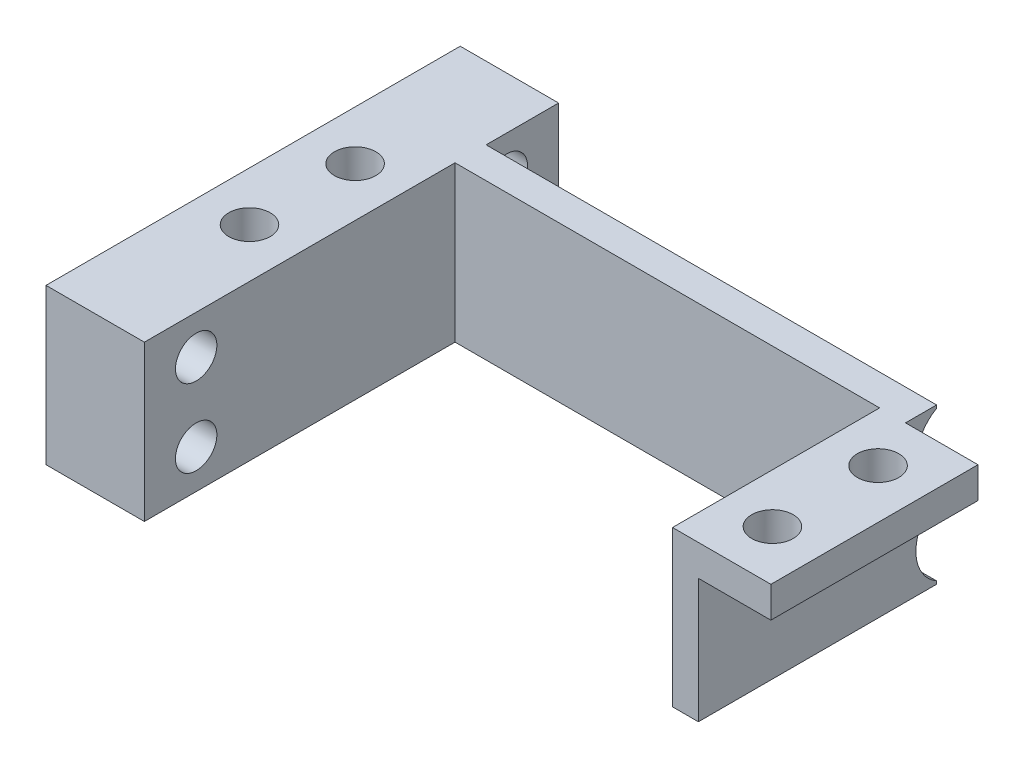
ISO-10303-21;
HEADER;
FILE_DESCRIPTION(('STEP AP214'),'2;1');
FILE_NAME('part.step','',(''),(''),'','','');
FILE_SCHEMA(('AUTOMOTIVE_DESIGN { 1 0 10303 214 1 1 1 1 }'));
ENDSEC;
DATA;
#1=APPLICATION_CONTEXT('core data for automotive mechanical design processes');
#2=APPLICATION_PROTOCOL_DEFINITION('international standard','automotive_design',2000,#1);
#3=PRODUCT_CONTEXT('',#1,'mechanical');
#4=PRODUCT('Part','Part','',(#3));
#5=PRODUCT_RELATED_PRODUCT_CATEGORY('part','',(#4));
#6=PRODUCT_DEFINITION_FORMATION('','',#4);
#7=PRODUCT_DEFINITION_CONTEXT('part definition',#1,'design');
#8=PRODUCT_DEFINITION('design','',#6,#7);
#9=PRODUCT_DEFINITION_SHAPE('','',#8);
#10=(LENGTH_UNIT() NAMED_UNIT(*) SI_UNIT(.MILLI.,.METRE.));
#11=(NAMED_UNIT(*) PLANE_ANGLE_UNIT() SI_UNIT($,.RADIAN.));
#12=(NAMED_UNIT(*) SI_UNIT($,.STERADIAN.) SOLID_ANGLE_UNIT());
#13=UNCERTAINTY_MEASURE_WITH_UNIT(LENGTH_MEASURE(1.E-05),#10,'distance_accuracy_value','');
#14=(GEOMETRIC_REPRESENTATION_CONTEXT(3) GLOBAL_UNCERTAINTY_ASSIGNED_CONTEXT((#13)) GLOBAL_UNIT_ASSIGNED_CONTEXT((#10,
#11,#12)) REPRESENTATION_CONTEXT('',''));
#15=CARTESIAN_POINT('',(0.,0.,0.));
#16=DIRECTION('',(0.,0.,1.));
#17=DIRECTION('',(1.,0.,0.));
#18=AXIS2_PLACEMENT_3D('',#15,#16,#17);
#19=CARTESIAN_POINT('',(0.,0.,0.));
#20=DIRECTION('',(0.,0.,-1.));
#21=DIRECTION('',(-1.,0.,0.));
#22=AXIS2_PLACEMENT_3D('',#19,#20,#21);
#23=PLANE('',#22);
#24=DIRECTION('',(0.,-1.,0.));
#25=VECTOR('',#24,1.);
#26=CARTESIAN_POINT('',(2.5,0.,0.));
#27=LINE('',#26,#25);
#28=CARTESIAN_POINT('',(2.5,7.78589838486224,0.));
#29=VERTEX_POINT('',#28);
#30=CARTESIAN_POINT('',(2.5,7.21410161513775,0.));
#31=VERTEX_POINT('',#30);
#32=EDGE_CURVE('E47',#29,#31,#27,.T.);
#33=ORIENTED_EDGE('',*,*,#32,.F.);
#34=DIRECTION('',(-1.,0.,0.));
#35=VECTOR('',#34,1.);
#36=CARTESIAN_POINT('',(53.001,7.78589838486224,0.));
#37=LINE('',#36,#35);
#38=CARTESIAN_POINT('',(46.,7.78589838486224,0.));
#39=VERTEX_POINT('',#38);
#40=EDGE_CURVE('E191',#39,#29,#37,.T.);
#41=ORIENTED_EDGE('',*,*,#40,.F.);
#42=DIRECTION('',(0.,1.,0.));
#43=VECTOR('',#42,1.);
#44=CARTESIAN_POINT('',(46.,0.,0.));
#45=LINE('',#44,#43);
#46=CARTESIAN_POINT('',(46.,7.21410161513775,0.));
#47=VERTEX_POINT('',#46);
#48=EDGE_CURVE('E352',#47,#39,#45,.T.);
#49=ORIENTED_EDGE('',*,*,#48,.F.);
#50=DIRECTION('',(-1.,0.,0.));
#51=VECTOR('',#50,1.);
#52=CARTESIAN_POINT('',(53.001,7.21410161513775,0.));
#53=LINE('',#52,#51);
#54=EDGE_CURVE('E455',#31,#47,#53,.F.);
#55=ORIENTED_EDGE('',*,*,#54,.F.);
#56=EDGE_LOOP('',(#33,#41,#49,#55));
#57=FACE_BOUND('',#56,.T.);
#58=ADVANCED_FACE('F38',(#57),#23,.T.);
#59=CARTESIAN_POINT('',(46.,14.7141016151377,0.));
#60=VERTEX_POINT('',#59);
#61=CARTESIAN_POINT('',(46.,15.,0.));
#62=VERTEX_POINT('',#61);
#63=EDGE_CURVE('E204',#60,#62,#45,.T.);
#64=ORIENTED_EDGE('',*,*,#63,.F.);
#65=DIRECTION('',(-1.,0.,0.));
#66=VECTOR('',#65,1.);
#67=CARTESIAN_POINT('',(53.001,14.7141016151377,0.));
#68=LINE('',#67,#66);
#69=CARTESIAN_POINT('',(2.5,14.7141016151377,0.));
#70=VERTEX_POINT('',#69);
#71=EDGE_CURVE('E188',#70,#60,#68,.F.);
#72=ORIENTED_EDGE('',*,*,#71,.F.);
#73=CARTESIAN_POINT('',(2.5,15.,0.));
#74=VERTEX_POINT('',#73);
#75=EDGE_CURVE('E11',#74,#70,#27,.T.);
#76=ORIENTED_EDGE('',*,*,#75,.F.);
#77=DIRECTION('',(-1.,0.,0.));
#78=VECTOR('',#77,1.);
#79=CARTESIAN_POINT('',(0.,15.,0.));
#80=LINE('',#79,#78);
#81=EDGE_CURVE('E345',#62,#74,#80,.T.);
#82=ORIENTED_EDGE('',*,*,#81,.F.);
#83=EDGE_LOOP('',(#64,#72,#76,#82));
#84=FACE_BOUND('',#83,.T.);
#85=ADVANCED_FACE('F201',(#84),#23,.T.);
#86=CARTESIAN_POINT('',(2.5,0.285898384862242,0.));
#87=VERTEX_POINT('',#86);
#88=CARTESIAN_POINT('',(2.5,0.,0.));
#89=VERTEX_POINT('',#88);
#90=EDGE_CURVE('E49',#87,#89,#27,.T.);
#91=ORIENTED_EDGE('',*,*,#90,.F.);
#92=DIRECTION('',(-1.,0.,0.));
#93=VECTOR('',#92,1.);
#94=CARTESIAN_POINT('',(53.001,0.285898384862242,0.));
#95=LINE('',#94,#93);
#96=CARTESIAN_POINT('',(46.,0.285898384862242,0.));
#97=VERTEX_POINT('',#96);
#98=EDGE_CURVE('E205',#97,#87,#95,.T.);
#99=ORIENTED_EDGE('',*,*,#98,.F.);
#100=CARTESIAN_POINT('',(46.,0.,0.));
#101=VERTEX_POINT('',#100);
#102=EDGE_CURVE('E349',#101,#97,#45,.T.);
#103=ORIENTED_EDGE('',*,*,#102,.F.);
#104=DIRECTION('',(1.,0.,0.));
#105=VECTOR('',#104,1.);
#106=CARTESIAN_POINT('',(0.,0.,0.));
#107=LINE('',#106,#105);
#108=EDGE_CURVE('E342',#89,#101,#107,.T.);
#109=ORIENTED_EDGE('',*,*,#108,.F.);
#110=EDGE_LOOP('',(#91,#99,#103,#109));
#111=FACE_BOUND('',#110,.T.);
#112=ADVANCED_FACE('F432',(#111),#23,.T.);
#113=CARTESIAN_POINT('',(0.,0.,3.));
#114=DIRECTION('',(1.,0.,0.));
#115=DIRECTION('',(0.,0.,-1.));
#116=AXIS2_PLACEMENT_3D('',#113,#114,#115);
#117=PLANE('',#116);
#118=DIRECTION('',(0.,0.,1.));
#119=VECTOR('',#118,1.);
#120=CARTESIAN_POINT('',(0.,12.,23.));
#121=LINE('',#120,#119);
#122=CARTESIAN_POINT('',(0.,12.,3.));
#123=VERTEX_POINT('',#122);
#124=CARTESIAN_POINT('',(0.,12.,23.));
#125=VERTEX_POINT('',#124);
#126=EDGE_CURVE('E320',#123,#125,#121,.T.);
#127=ORIENTED_EDGE('',*,*,#126,.F.);
#128=DIRECTION('',(0.,-1.,0.));
#129=VECTOR('',#128,1.);
#130=CARTESIAN_POINT('',(0.,0.,3.));
#131=LINE('',#130,#129);
#132=CARTESIAN_POINT('',(0.,0.,3.));
#133=VERTEX_POINT('',#132);
#134=EDGE_CURVE('E230',#123,#133,#131,.T.);
#135=ORIENTED_EDGE('',*,*,#134,.T.);
#136=DIRECTION('',(0.,0.,-1.));
#137=VECTOR('',#136,1.);
#138=CARTESIAN_POINT('',(0.,0.,3.));
#139=LINE('',#138,#137);
#140=CARTESIAN_POINT('',(0.,0.,23.));
#141=VERTEX_POINT('',#140);
#142=EDGE_CURVE('E359',#141,#133,#139,.T.);
#143=ORIENTED_EDGE('',*,*,#142,.F.);
#144=DIRECTION('',(0.,-1.,0.));
#145=VECTOR('',#144,1.);
#146=CARTESIAN_POINT('',(0.,0.,23.));
#147=LINE('',#146,#145);
#148=EDGE_CURVE('E332',#125,#141,#147,.T.);
#149=ORIENTED_EDGE('',*,*,#148,.F.);
#150=EDGE_LOOP('',(#127,#135,#143,#149));
#151=FACE_BOUND('',#150,.T.);
#152=ADVANCED_FACE('F40',(#151),#117,.F.);
#153=CARTESIAN_POINT('',(0.,0.,3.));
#154=DIRECTION('',(0.,0.,-1.));
#155=DIRECTION('',(-1.,0.,0.));
#156=AXIS2_PLACEMENT_3D('',#153,#154,#155);
#157=PLANE('',#156);
#158=DIRECTION('',(1.,0.,0.));
#159=VECTOR('',#158,1.);
#160=CARTESIAN_POINT('',(0.,0.,3.));
#161=LINE('',#160,#159);
#162=CARTESIAN_POINT('',(2.5,0.,3.));
#163=VERTEX_POINT('',#162);
#164=CARTESIAN_POINT('',(43.5,0.,3.));
#165=VERTEX_POINT('',#164);
#166=EDGE_CURVE('E64',#163,#165,#161,.T.);
#167=ORIENTED_EDGE('',*,*,#166,.T.);
#168=DIRECTION('',(0.,1.,0.));
#169=VECTOR('',#168,1.);
#170=CARTESIAN_POINT('',(43.5,0.,3.));
#171=LINE('',#170,#169);
#172=CARTESIAN_POINT('',(43.5,15.,3.));
#173=VERTEX_POINT('',#172);
#174=EDGE_CURVE('E293',#165,#173,#171,.T.);
#175=ORIENTED_EDGE('',*,*,#174,.T.);
#176=DIRECTION('',(-1.,0.,0.));
#177=VECTOR('',#176,1.);
#178=CARTESIAN_POINT('',(0.,15.,3.));
#179=LINE('',#178,#177);
#180=CARTESIAN_POINT('',(2.5,15.,3.));
#181=VERTEX_POINT('',#180);
#182=EDGE_CURVE('E344',#173,#181,#179,.T.);
#183=ORIENTED_EDGE('',*,*,#182,.T.);
#184=DIRECTION('',(0.,1.,0.));
#185=VECTOR('',#184,1.);
#186=CARTESIAN_POINT('',(2.5,0.,3.));
#187=LINE('',#186,#185);
#188=EDGE_CURVE('E331',#163,#181,#187,.T.);
#189=ORIENTED_EDGE('',*,*,#188,.F.);
#190=EDGE_LOOP('',(#167,#175,#183,#189));
#191=FACE_BOUND('',#190,.T.);
#192=ADVANCED_FACE('F445',(#191),#157,.F.);
#193=CARTESIAN_POINT('',(0.,0.,3.));
#194=DIRECTION('',(0.,1.,0.));
#195=DIRECTION('',(0.,0.,1.));
#196=AXIS2_PLACEMENT_3D('',#193,#194,#195);
#197=PLANE('',#196);
#198=ORIENTED_EDGE('',*,*,#142,.T.);
#199=DIRECTION('',(1.,0.,0.));
#200=VECTOR('',#199,1.);
#201=CARTESIAN_POINT('',(2.5,0.,3.));
#202=LINE('',#201,#200);
#203=CARTESIAN_POINT('',(-7.00000000000001,0.,3.));
#204=VERTEX_POINT('',#203);
#205=EDGE_CURVE('E375',#204,#133,#202,.T.);
#206=ORIENTED_EDGE('',*,*,#205,.F.);
#207=DIRECTION('',(0.,0.,1.));
#208=VECTOR('',#207,1.);
#209=CARTESIAN_POINT('',(-7.00000000000001,0.,-7.));
#210=LINE('',#209,#208);
#211=CARTESIAN_POINT('',(-7.00000000000001,0.,-7.));
#212=VERTEX_POINT('',#211);
#213=EDGE_CURVE('E216',#212,#204,#210,.T.);
#214=ORIENTED_EDGE('',*,*,#213,.F.);
#215=DIRECTION('',(1.,0.,0.));
#216=VECTOR('',#215,1.);
#217=CARTESIAN_POINT('',(2.5,0.,-7.));
#218=LINE('',#217,#216);
#219=CARTESIAN_POINT('',(2.5,0.,-7.));
#220=VERTEX_POINT('',#219);
#221=EDGE_CURVE('E387',#212,#220,#218,.T.);
#222=ORIENTED_EDGE('',*,*,#221,.T.);
#223=DIRECTION('',(0.,0.,1.));
#224=VECTOR('',#223,1.);
#225=CARTESIAN_POINT('',(2.5,0.,-7.));
#226=LINE('',#225,#224);
#227=EDGE_CURVE('E220',#220,#89,#226,.T.);
#228=ORIENTED_EDGE('',*,*,#227,.T.);
#229=ORIENTED_EDGE('',*,*,#108,.T.);
#230=DIRECTION('',(0.,0.,-1.));
#231=VECTOR('',#230,1.);
#232=CARTESIAN_POINT('',(46.,0.,3.));
#233=LINE('',#232,#231);
#234=CARTESIAN_POINT('',(46.,0.,23.));
#235=VERTEX_POINT('',#234);
#236=EDGE_CURVE('E356',#235,#101,#233,.T.);
#237=ORIENTED_EDGE('',*,*,#236,.F.);
#238=DIRECTION('',(-1.,0.,0.));
#239=VECTOR('',#238,1.);
#240=CARTESIAN_POINT('',(46.,0.,23.));
#241=LINE('',#240,#239);
#242=CARTESIAN_POINT('',(43.5,0.,23.));
#243=VERTEX_POINT('',#242);
#244=EDGE_CURVE('E301',#235,#243,#241,.T.);
#245=ORIENTED_EDGE('',*,*,#244,.T.);
#246=DIRECTION('',(0.,0.,-1.));
#247=VECTOR('',#246,1.);
#248=CARTESIAN_POINT('',(43.5,0.,23.));
#249=LINE('',#248,#247);
#250=EDGE_CURVE('E304',#243,#165,#249,.T.);
#251=ORIENTED_EDGE('',*,*,#250,.T.);
#252=ORIENTED_EDGE('',*,*,#166,.F.);
#253=DIRECTION('',(0.,0.,-1.));
#254=VECTOR('',#253,1.);
#255=CARTESIAN_POINT('',(2.5,0.,23.));
#256=LINE('',#255,#254);
#257=CARTESIAN_POINT('',(2.5,0.,33.));
#258=VERTEX_POINT('',#257);
#259=EDGE_CURVE('E339',#258,#163,#256,.T.);
#260=ORIENTED_EDGE('',*,*,#259,.F.);
#261=DIRECTION('',(1.,0.,0.));
#262=VECTOR('',#261,1.);
#263=CARTESIAN_POINT('',(2.5,0.,33.));
#264=LINE('',#263,#262);
#265=CARTESIAN_POINT('',(-7.00000000000001,0.,33.));
#266=VERTEX_POINT('',#265);
#267=EDGE_CURVE('E255',#266,#258,#264,.T.);
#268=ORIENTED_EDGE('',*,*,#267,.F.);
#269=DIRECTION('',(0.,0.,-1.));
#270=VECTOR('',#269,1.);
#271=CARTESIAN_POINT('',(-7.00000000000001,0.,33.));
#272=LINE('',#271,#270);
#273=CARTESIAN_POINT('',(-7.00000000000001,0.,23.));
#274=VERTEX_POINT('',#273);
#275=EDGE_CURVE('E258',#266,#274,#272,.T.);
#276=ORIENTED_EDGE('',*,*,#275,.T.);
#277=DIRECTION('',(1.,0.,0.));
#278=VECTOR('',#277,1.);
#279=CARTESIAN_POINT('',(2.5,0.,23.));
#280=LINE('',#279,#278);
#281=EDGE_CURVE('E250',#274,#141,#280,.T.);
#282=ORIENTED_EDGE('',*,*,#281,.T.);
#283=EDGE_LOOP('',(#198,#206,#214,#222,#228,#229,#237,#245,#251,#252,#260,#268,#276,#282));
#284=FACE_BOUND('',#283,.T.);
#285=ADVANCED_FACE('F401',(#284),#197,.F.);
#286=CARTESIAN_POINT('',(46.,0.,3.));
#287=DIRECTION('',(-1.,0.,0.));
#288=DIRECTION('',(0.,0.,1.));
#289=AXIS2_PLACEMENT_3D('',#286,#287,#288);
#290=PLANE('',#289);
#291=CARTESIAN_POINT('',(46.,11.25,-2.));
#292=DIRECTION('',(-1.,0.,0.));
#293=DIRECTION('',(0.,0.,1.));
#294=AXIS2_PLACEMENT_3D('',#291,#292,#293);
#295=CIRCLE('',#294,4.);
#296=EDGE_CURVE('E196',#39,#60,#295,.T.);
#297=ORIENTED_EDGE('',*,*,#296,.T.);
#298=ORIENTED_EDGE('',*,*,#63,.T.);
#299=DIRECTION('',(0.,0.,-1.));
#300=VECTOR('',#299,1.);
#301=CARTESIAN_POINT('',(46.,15.,3.));
#302=LINE('',#301,#300);
#303=CARTESIAN_POINT('',(46.,15.,3.));
#304=VERTEX_POINT('',#303);
#305=EDGE_CURVE('E347',#304,#62,#302,.T.);
#306=ORIENTED_EDGE('',*,*,#305,.F.);
#307=DIRECTION('',(0.,-1.,0.));
#308=VECTOR('',#307,1.);
#309=CARTESIAN_POINT('',(46.,15.,3.));
#310=LINE('',#309,#308);
#311=CARTESIAN_POINT('',(46.,12.,3.));
#312=VERTEX_POINT('',#311);
#313=EDGE_CURVE('E275',#304,#312,#310,.T.);
#314=ORIENTED_EDGE('',*,*,#313,.T.);
#315=DIRECTION('',(0.,0.,1.));
#316=VECTOR('',#315,1.);
#317=CARTESIAN_POINT('',(46.,12.,23.));
#318=LINE('',#317,#316);
#319=CARTESIAN_POINT('',(46.,12.,23.));
#320=VERTEX_POINT('',#319);
#321=EDGE_CURVE('E284',#312,#320,#318,.T.);
#322=ORIENTED_EDGE('',*,*,#321,.T.);
#323=DIRECTION('',(0.,-1.,0.));
#324=VECTOR('',#323,1.);
#325=CARTESIAN_POINT('',(46.,0.,23.));
#326=LINE('',#325,#324);
#327=EDGE_CURVE('E294',#320,#235,#326,.T.);
#328=ORIENTED_EDGE('',*,*,#327,.T.);
#329=ORIENTED_EDGE('',*,*,#236,.T.);
#330=ORIENTED_EDGE('',*,*,#102,.T.);
#331=CARTESIAN_POINT('',(46.,3.75,-2.));
#332=DIRECTION('',(-1.,0.,0.));
#333=DIRECTION('',(0.,0.,1.));
#334=AXIS2_PLACEMENT_3D('',#331,#332,#333);
#335=CIRCLE('',#334,4.);
#336=EDGE_CURVE('E383',#97,#47,#335,.T.);
#337=ORIENTED_EDGE('',*,*,#336,.T.);
#338=ORIENTED_EDGE('',*,*,#48,.T.);
#339=EDGE_LOOP('',(#297,#298,#306,#314,#322,#328,#329,#330,#337,#338));
#340=FACE_BOUND('',#339,.T.);
#341=ADVANCED_FACE('F463',(#340),#290,.F.);
#342=CARTESIAN_POINT('',(0.,15.,3.));
#343=DIRECTION('',(0.,-1.,0.));
#344=DIRECTION('',(0.,0.,-1.));
#345=AXIS2_PLACEMENT_3D('',#342,#343,#344);
#346=PLANE('',#345);
#347=CARTESIAN_POINT('',(-2.25,15.,18.1));
#348=DIRECTION('',(0.,1.,0.));
#349=DIRECTION('',(0.,0.,1.));
#350=AXIS2_PLACEMENT_3D('',#347,#348,#349);
#351=CIRCLE('',#350,2.);
#352=CARTESIAN_POINT('',(-2.25,15.,20.1));
#353=VERTEX_POINT('',#352);
#354=EDGE_CURVE('E311',#353,#353,#351,.T.);
#355=ORIENTED_EDGE('',*,*,#354,.F.);
#356=EDGE_LOOP('',(#355));
#357=FACE_BOUND('',#356,.T.);
#358=CARTESIAN_POINT('',(-2.25,15.,7.9));
#359=DIRECTION('',(0.,1.,0.));
#360=DIRECTION('',(0.,0.,-1.));
#361=AXIS2_PLACEMENT_3D('',#358,#359,#360);
#362=CIRCLE('',#361,2.);
#363=CARTESIAN_POINT('',(-2.25,15.,5.9));
#364=VERTEX_POINT('',#363);
#365=EDGE_CURVE('E310',#364,#364,#362,.T.);
#366=ORIENTED_EDGE('',*,*,#365,.F.);
#367=EDGE_LOOP('',(#366));
#368=FACE_BOUND('',#367,.T.);
#369=DIRECTION('',(0.,0.,-1.));
#370=VECTOR('',#369,1.);
#371=CARTESIAN_POINT('',(2.5,15.,23.));
#372=LINE('',#371,#370);
#373=CARTESIAN_POINT('',(2.5,15.,33.));
#374=VERTEX_POINT('',#373);
#375=EDGE_CURVE('E334',#374,#181,#372,.T.);
#376=ORIENTED_EDGE('',*,*,#375,.T.);
#377=ORIENTED_EDGE('',*,*,#182,.F.);
#378=DIRECTION('',(0.,0.,-1.));
#379=VECTOR('',#378,1.);
#380=CARTESIAN_POINT('',(43.5,15.,23.));
#381=LINE('',#380,#379);
#382=CARTESIAN_POINT('',(43.5,15.,23.));
#383=VERTEX_POINT('',#382);
#384=EDGE_CURVE('E307',#383,#173,#381,.T.);
#385=ORIENTED_EDGE('',*,*,#384,.F.);
#386=DIRECTION('',(1.,0.,0.));
#387=VECTOR('',#386,1.);
#388=CARTESIAN_POINT('',(46.,15.,23.));
#389=LINE('',#388,#387);
#390=CARTESIAN_POINT('',(53.,15.,23.));
#391=VERTEX_POINT('',#390);
#392=EDGE_CURVE('E296',#383,#391,#389,.T.);
#393=ORIENTED_EDGE('',*,*,#392,.T.);
#394=DIRECTION('',(0.,0.,-1.));
#395=VECTOR('',#394,1.);
#396=CARTESIAN_POINT('',(53.,15.,23.));
#397=LINE('',#396,#395);
#398=CARTESIAN_POINT('',(53.,15.,3.));
#399=VERTEX_POINT('',#398);
#400=EDGE_CURVE('E280',#391,#399,#397,.T.);
#401=ORIENTED_EDGE('',*,*,#400,.T.);
#402=DIRECTION('',(-1.,0.,0.));
#403=VECTOR('',#402,1.);
#404=CARTESIAN_POINT('',(53.,15.,3.));
#405=LINE('',#404,#403);
#406=EDGE_CURVE('E283',#399,#304,#405,.T.);
#407=ORIENTED_EDGE('',*,*,#406,.T.);
#408=ORIENTED_EDGE('',*,*,#305,.T.);
#409=ORIENTED_EDGE('',*,*,#81,.T.);
#410=DIRECTION('',(0.,0.,1.));
#411=VECTOR('',#410,1.);
#412=CARTESIAN_POINT('',(2.5,15.,-7.));
#413=LINE('',#412,#411);
#414=CARTESIAN_POINT('',(2.5,15.,-7.));
#415=VERTEX_POINT('',#414);
#416=EDGE_CURVE('E210',#415,#74,#413,.T.);
#417=ORIENTED_EDGE('',*,*,#416,.F.);
#418=DIRECTION('',(-1.,0.,0.));
#419=VECTOR('',#418,1.);
#420=CARTESIAN_POINT('',(2.5,15.,-7.));
#421=LINE('',#420,#419);
#422=CARTESIAN_POINT('',(-7.00000000000001,15.,-7.));
#423=VERTEX_POINT('',#422);
#424=EDGE_CURVE('E217',#415,#423,#421,.T.);
#425=ORIENTED_EDGE('',*,*,#424,.T.);
#426=DIRECTION('',(0.,0.,-1.));
#427=VECTOR('',#426,1.);
#428=CARTESIAN_POINT('',(-7.,15.,23.));
#429=LINE('',#428,#427);
#430=CARTESIAN_POINT('',(-7.00000000000001,15.,33.));
#431=VERTEX_POINT('',#430);
#432=EDGE_CURVE('E317',#431,#423,#429,.T.);
#433=ORIENTED_EDGE('',*,*,#432,.F.);
#434=DIRECTION('',(-1.,0.,0.));
#435=VECTOR('',#434,1.);
#436=CARTESIAN_POINT('',(2.5,15.,33.));
#437=LINE('',#436,#435);
#438=EDGE_CURVE('E249',#374,#431,#437,.T.);
#439=ORIENTED_EDGE('',*,*,#438,.F.);
#440=EDGE_LOOP('',(#376,#377,#385,#393,#401,#407,#408,#409,#417,#425,#433,#439));
#441=FACE_BOUND('',#440,.T.);
#442=CARTESIAN_POINT('',(48.25,15.,7.9));
#443=DIRECTION('',(0.,-1.,0.));
#444=DIRECTION('',(0.,0.,-1.));
#445=AXIS2_PLACEMENT_3D('',#442,#443,#444);
#446=CIRCLE('',#445,2.);
#447=CARTESIAN_POINT('',(48.25,15.,5.9));
#448=VERTEX_POINT('',#447);
#449=EDGE_CURVE('E264',#448,#448,#446,.T.);
#450=ORIENTED_EDGE('',*,*,#449,.T.);
#451=EDGE_LOOP('',(#450));
#452=FACE_BOUND('',#451,.T.);
#453=CARTESIAN_POINT('',(48.25,15.,18.1));
#454=DIRECTION('',(0.,-1.,0.));
#455=DIRECTION('',(0.,0.,1.));
#456=AXIS2_PLACEMENT_3D('',#453,#454,#455);
#457=CIRCLE('',#456,2.);
#458=CARTESIAN_POINT('',(48.25,15.,20.1));
#459=VERTEX_POINT('',#458);
#460=EDGE_CURVE('E265',#459,#459,#457,.T.);
#461=ORIENTED_EDGE('',*,*,#460,.T.);
#462=EDGE_LOOP('',(#461));
#463=FACE_BOUND('',#462,.T.);
#464=ADVANCED_FACE('F503',(#357,#368,#441,#452,#463),#346,.F.);
#465=CARTESIAN_POINT('',(2.5,0.,23.));
#466=DIRECTION('',(-1.,0.,0.));
#467=DIRECTION('',(0.,0.,1.));
#468=AXIS2_PLACEMENT_3D('',#465,#466,#467);
#469=PLANE('',#468);
#470=CARTESIAN_POINT('',(2.5,11.25,28.));
#471=DIRECTION('',(-1.,0.,0.));
#472=DIRECTION('',(0.,0.,1.));
#473=AXIS2_PLACEMENT_3D('',#470,#471,#472);
#474=CIRCLE('',#473,2.);
#475=CARTESIAN_POINT('',(2.5,11.25,30.));
#476=VERTEX_POINT('',#475);
#477=EDGE_CURVE('E242',#476,#476,#474,.T.);
#478=ORIENTED_EDGE('',*,*,#477,.T.);
#479=EDGE_LOOP('',(#478));
#480=FACE_BOUND('',#479,.T.);
#481=CARTESIAN_POINT('',(2.5,3.75,28.));
#482=DIRECTION('',(-1.,0.,0.));
#483=DIRECTION('',(0.,0.,1.));
#484=AXIS2_PLACEMENT_3D('',#481,#482,#483);
#485=CIRCLE('',#484,2.);
#486=CARTESIAN_POINT('',(2.5,3.75,30.));
#487=VERTEX_POINT('',#486);
#488=EDGE_CURVE('E237',#487,#487,#485,.T.);
#489=ORIENTED_EDGE('',*,*,#488,.T.);
#490=EDGE_LOOP('',(#489));
#491=FACE_BOUND('',#490,.T.);
#492=ORIENTED_EDGE('',*,*,#188,.T.);
#493=ORIENTED_EDGE('',*,*,#375,.F.);
#494=DIRECTION('',(0.,1.,0.));
#495=VECTOR('',#494,1.);
#496=CARTESIAN_POINT('',(2.5,15.,33.));
#497=LINE('',#496,#495);
#498=EDGE_CURVE('E246',#258,#374,#497,.T.);
#499=ORIENTED_EDGE('',*,*,#498,.F.);
#500=ORIENTED_EDGE('',*,*,#259,.T.);
#501=EDGE_LOOP('',(#492,#493,#499,#500));
#502=FACE_BOUND('',#501,.T.);
#503=ADVANCED_FACE('F501',(#480,#491,#502),#469,.F.);
#504=CARTESIAN_POINT('',(-7.,12.,23.));
#505=DIRECTION('',(0.,1.,0.));
#506=DIRECTION('',(0.,0.,1.));
#507=AXIS2_PLACEMENT_3D('',#504,#505,#506);
#508=PLANE('',#507);
#509=CARTESIAN_POINT('',(-2.25,12.,18.1));
#510=DIRECTION('',(0.,1.,0.));
#511=DIRECTION('',(0.,0.,1.));
#512=AXIS2_PLACEMENT_3D('',#509,#510,#511);
#513=CIRCLE('',#512,2.);
#514=CARTESIAN_POINT('',(-2.25,12.,20.1));
#515=VERTEX_POINT('',#514);
#516=EDGE_CURVE('E326',#515,#515,#513,.T.);
#517=ORIENTED_EDGE('',*,*,#516,.T.);
#518=EDGE_LOOP('',(#517));
#519=FACE_BOUND('',#518,.T.);
#520=CARTESIAN_POINT('',(-2.25,12.,7.9));
#521=DIRECTION('',(0.,1.,0.));
#522=DIRECTION('',(0.,0.,1.));
#523=AXIS2_PLACEMENT_3D('',#520,#521,#522);
#524=CIRCLE('',#523,2.);
#525=CARTESIAN_POINT('',(-2.25,12.,9.9));
#526=VERTEX_POINT('',#525);
#527=EDGE_CURVE('E314',#526,#526,#524,.T.);
#528=ORIENTED_EDGE('',*,*,#527,.T.);
#529=EDGE_LOOP('',(#528));
#530=FACE_BOUND('',#529,.T.);
#531=ORIENTED_EDGE('',*,*,#126,.T.);
#532=DIRECTION('',(1.,0.,0.));
#533=VECTOR('',#532,1.);
#534=CARTESIAN_POINT('',(-7.,12.,23.));
#535=LINE('',#534,#533);
#536=CARTESIAN_POINT('',(-7.00000000000001,12.,23.));
#537=VERTEX_POINT('',#536);
#538=EDGE_CURVE('E323',#537,#125,#535,.T.);
#539=ORIENTED_EDGE('',*,*,#538,.F.);
#540=DIRECTION('',(0.,0.,1.));
#541=VECTOR('',#540,1.);
#542=CARTESIAN_POINT('',(-7.,12.,23.));
#543=LINE('',#542,#541);
#544=CARTESIAN_POINT('',(-7.,12.,3.));
#545=VERTEX_POINT('',#544);
#546=EDGE_CURVE('E319',#545,#537,#543,.T.);
#547=ORIENTED_EDGE('',*,*,#546,.F.);
#548=DIRECTION('',(1.,0.,0.));
#549=VECTOR('',#548,1.);
#550=CARTESIAN_POINT('',(-7.,12.,3.));
#551=LINE('',#550,#549);
#552=EDGE_CURVE('E328',#545,#123,#551,.T.);
#553=ORIENTED_EDGE('',*,*,#552,.T.);
#554=EDGE_LOOP('',(#531,#539,#547,#553));
#555=FACE_BOUND('',#554,.T.);
#556=ADVANCED_FACE('F409',(#519,#530,#555),#508,.F.);
#557=CARTESIAN_POINT('',(-7.,0.,0.));
#558=DIRECTION('',(1.,0.,0.));
#559=DIRECTION('',(0.,0.,-1.));
#560=AXIS2_PLACEMENT_3D('',#557,#558,#559);
#561=PLANE('',#560);
#562=CARTESIAN_POINT('',(-7.,11.25,-2.));
#563=DIRECTION('',(1.,0.,0.));
#564=DIRECTION('',(0.,0.,-1.));
#565=AXIS2_PLACEMENT_3D('',#562,#563,#564);
#566=CIRCLE('',#565,2.);
#567=CARTESIAN_POINT('',(-7.,11.25,-4.));
#568=VERTEX_POINT('',#567);
#569=EDGE_CURVE('E371',#568,#568,#566,.T.);
#570=ORIENTED_EDGE('',*,*,#569,.T.);
#571=EDGE_LOOP('',(#570));
#572=FACE_BOUND('',#571,.T.);
#573=CARTESIAN_POINT('',(-7.,3.75,-2.));
#574=DIRECTION('',(1.,0.,0.));
#575=DIRECTION('',(0.,0.,1.));
#576=AXIS2_PLACEMENT_3D('',#573,#574,#575);
#577=CIRCLE('',#576,2.);
#578=CARTESIAN_POINT('',(-7.,3.75,0.));
#579=VERTEX_POINT('',#578);
#580=EDGE_CURVE('E195',#579,#579,#577,.T.);
#581=ORIENTED_EDGE('',*,*,#580,.T.);
#582=EDGE_LOOP('',(#581));
#583=FACE_BOUND('',#582,.T.);
#584=CARTESIAN_POINT('',(-7.,11.25,28.));
#585=DIRECTION('',(-1.,0.,0.));
#586=DIRECTION('',(0.,0.,1.));
#587=AXIS2_PLACEMENT_3D('',#584,#585,#586);
#588=CIRCLE('',#587,2.);
#589=CARTESIAN_POINT('',(-7.,11.25,30.));
#590=VERTEX_POINT('',#589);
#591=EDGE_CURVE('E234',#590,#590,#588,.T.);
#592=ORIENTED_EDGE('',*,*,#591,.F.);
#593=EDGE_LOOP('',(#592));
#594=FACE_BOUND('',#593,.T.);
#595=CARTESIAN_POINT('',(-7.,3.75,28.));
#596=DIRECTION('',(-1.,0.,0.));
#597=DIRECTION('',(0.,0.,-1.));
#598=AXIS2_PLACEMENT_3D('',#595,#596,#597);
#599=CIRCLE('',#598,2.);
#600=CARTESIAN_POINT('',(-7.,3.75,26.));
#601=VERTEX_POINT('',#600);
#602=EDGE_CURVE('E233',#601,#601,#599,.T.);
#603=ORIENTED_EDGE('',*,*,#602,.F.);
#604=EDGE_LOOP('',(#603));
#605=FACE_BOUND('',#604,.T.);
#606=ORIENTED_EDGE('',*,*,#546,.T.);
#607=DIRECTION('',(0.,-1.,0.));
#608=VECTOR('',#607,1.);
#609=CARTESIAN_POINT('',(-7.00000000000001,15.,23.));
#610=LINE('',#609,#608);
#611=EDGE_CURVE('E245',#537,#274,#610,.T.);
#612=ORIENTED_EDGE('',*,*,#611,.T.);
#613=ORIENTED_EDGE('',*,*,#275,.F.);
#614=DIRECTION('',(0.,-1.,0.));
#615=VECTOR('',#614,1.);
#616=CARTESIAN_POINT('',(-7.00000000000001,15.,33.));
#617=LINE('',#616,#615);
#618=EDGE_CURVE('E253',#431,#266,#617,.T.);
#619=ORIENTED_EDGE('',*,*,#618,.F.);
#620=ORIENTED_EDGE('',*,*,#432,.T.);
#621=DIRECTION('',(0.,-1.,0.));
#622=VECTOR('',#621,1.);
#623=CARTESIAN_POINT('',(-7.00000000000001,15.,-7.));
#624=LINE('',#623,#622);
#625=EDGE_CURVE('E222',#423,#212,#624,.T.);
#626=ORIENTED_EDGE('',*,*,#625,.T.);
#627=ORIENTED_EDGE('',*,*,#213,.T.);
#628=DIRECTION('',(0.,-1.,0.));
#629=VECTOR('',#628,1.);
#630=CARTESIAN_POINT('',(-7.00000000000001,15.,3.));
#631=LINE('',#630,#629);
#632=EDGE_CURVE('E225',#545,#204,#631,.T.);
#633=ORIENTED_EDGE('',*,*,#632,.F.);
#634=EDGE_LOOP('',(#606,#612,#613,#619,#620,#626,#627,#633));
#635=FACE_BOUND('',#634,.T.);
#636=ADVANCED_FACE('F397',(#572,#583,#594,#605,#635),#561,.F.);
#637=CARTESIAN_POINT('',(-2.25,8.,7.9));
#638=DIRECTION('',(0.,1.,0.));
#639=DIRECTION('',(0.,0.,1.));
#640=AXIS2_PLACEMENT_3D('',#637,#638,#639);
#641=CYLINDRICAL_SURFACE('',#640,2.);
#642=ORIENTED_EDGE('',*,*,#365,.T.);
#643=EDGE_LOOP('',(#642));
#644=FACE_BOUND('',#643,.T.);
#645=ORIENTED_EDGE('',*,*,#527,.F.);
#646=EDGE_LOOP('',(#645));
#647=FACE_BOUND('',#646,.T.);
#648=ADVANCED_FACE('F532',(#644,#647),#641,.F.);
#649=CARTESIAN_POINT('',(-2.25,8.,18.1));
#650=DIRECTION('',(0.,1.,0.));
#651=DIRECTION('',(0.,0.,1.));
#652=AXIS2_PLACEMENT_3D('',#649,#650,#651);
#653=CYLINDRICAL_SURFACE('',#652,2.);
#654=ORIENTED_EDGE('',*,*,#354,.T.);
#655=EDGE_LOOP('',(#654));
#656=FACE_BOUND('',#655,.T.);
#657=ORIENTED_EDGE('',*,*,#516,.F.);
#658=EDGE_LOOP('',(#657));
#659=FACE_BOUND('',#658,.T.);
#660=ADVANCED_FACE('F535',(#656,#659),#653,.F.);
#661=CARTESIAN_POINT('',(43.5,0.,23.));
#662=DIRECTION('',(-1.,0.,0.));
#663=DIRECTION('',(0.,0.,1.));
#664=AXIS2_PLACEMENT_3D('',#661,#662,#663);
#665=PLANE('',#664);
#666=ORIENTED_EDGE('',*,*,#174,.F.);
#667=ORIENTED_EDGE('',*,*,#250,.F.);
#668=DIRECTION('',(0.,1.,0.));
#669=VECTOR('',#668,1.);
#670=CARTESIAN_POINT('',(43.5,0.,23.));
#671=LINE('',#670,#669);
#672=EDGE_CURVE('E298',#243,#383,#671,.T.);
#673=ORIENTED_EDGE('',*,*,#672,.T.);
#674=ORIENTED_EDGE('',*,*,#384,.T.);
#675=EDGE_LOOP('',(#666,#667,#673,#674));
#676=FACE_BOUND('',#675,.T.);
#677=ADVANCED_FACE('F519',(#676),#665,.T.);
#678=CARTESIAN_POINT('',(46.,0.,23.));
#679=DIRECTION('',(0.,0.,-1.));
#680=DIRECTION('',(1.,0.,0.));
#681=AXIS2_PLACEMENT_3D('',#678,#679,#680);
#682=PLANE('',#681);
#683=ORIENTED_EDGE('',*,*,#327,.F.);
#684=DIRECTION('',(-1.,0.,0.));
#685=VECTOR('',#684,1.);
#686=CARTESIAN_POINT('',(53.,12.,23.));
#687=LINE('',#686,#685);
#688=CARTESIAN_POINT('',(53.,12.,23.));
#689=VERTEX_POINT('',#688);
#690=EDGE_CURVE('E56',#689,#320,#687,.T.);
#691=ORIENTED_EDGE('',*,*,#690,.F.);
#692=DIRECTION('',(0.,1.,0.));
#693=VECTOR('',#692,1.);
#694=CARTESIAN_POINT('',(53.,15.,23.));
#695=LINE('',#694,#693);
#696=EDGE_CURVE('E271',#689,#391,#695,.T.);
#697=ORIENTED_EDGE('',*,*,#696,.T.);
#698=ORIENTED_EDGE('',*,*,#392,.F.);
#699=ORIENTED_EDGE('',*,*,#672,.F.);
#700=ORIENTED_EDGE('',*,*,#244,.F.);
#701=EDGE_LOOP('',(#683,#691,#697,#698,#699,#700));
#702=FACE_BOUND('',#701,.T.);
#703=ADVANCED_FACE('F513',(#702),#682,.F.);
#704=CARTESIAN_POINT('',(53.,12.,23.));
#705=DIRECTION('',(0.,-1.,0.));
#706=DIRECTION('',(0.,0.,-1.));
#707=AXIS2_PLACEMENT_3D('',#704,#705,#706);
#708=PLANE('',#707);
#709=CARTESIAN_POINT('',(48.25,12.,18.1));
#710=DIRECTION('',(0.,-1.,0.));
#711=DIRECTION('',(0.,0.,-1.));
#712=AXIS2_PLACEMENT_3D('',#709,#710,#711);
#713=CIRCLE('',#712,2.);
#714=CARTESIAN_POINT('',(48.25,12.,16.1));
#715=VERTEX_POINT('',#714);
#716=EDGE_CURVE('E286',#715,#715,#713,.F.);
#717=ORIENTED_EDGE('',*,*,#716,.T.);
#718=EDGE_LOOP('',(#717));
#719=FACE_BOUND('',#718,.T.);
#720=CARTESIAN_POINT('',(48.25,12.,7.9));
#721=DIRECTION('',(0.,-1.,0.));
#722=DIRECTION('',(0.,0.,-1.));
#723=AXIS2_PLACEMENT_3D('',#720,#721,#722);
#724=CIRCLE('',#723,2.);
#725=CARTESIAN_POINT('',(48.25,12.,5.9));
#726=VERTEX_POINT('',#725);
#727=EDGE_CURVE('E268',#726,#726,#724,.F.);
#728=ORIENTED_EDGE('',*,*,#727,.T.);
#729=EDGE_LOOP('',(#728));
#730=FACE_BOUND('',#729,.T.);
#731=ORIENTED_EDGE('',*,*,#321,.F.);
#732=DIRECTION('',(-1.,0.,0.));
#733=VECTOR('',#732,1.);
#734=CARTESIAN_POINT('',(53.,12.,3.));
#735=LINE('',#734,#733);
#736=CARTESIAN_POINT('',(53.,12.,3.));
#737=VERTEX_POINT('',#736);
#738=EDGE_CURVE('E290',#737,#312,#735,.T.);
#739=ORIENTED_EDGE('',*,*,#738,.F.);
#740=DIRECTION('',(0.,0.,1.));
#741=VECTOR('',#740,1.);
#742=CARTESIAN_POINT('',(53.,12.,23.));
#743=LINE('',#742,#741);
#744=EDGE_CURVE('E274',#737,#689,#743,.T.);
#745=ORIENTED_EDGE('',*,*,#744,.T.);
#746=ORIENTED_EDGE('',*,*,#690,.T.);
#747=EDGE_LOOP('',(#731,#739,#745,#746));
#748=FACE_BOUND('',#747,.T.);
#749=ADVANCED_FACE('F542',(#719,#730,#748),#708,.T.);
#750=CARTESIAN_POINT('',(53.,15.,3.));
#751=DIRECTION('',(0.,0.,-1.));
#752=DIRECTION('',(-1.,0.,0.));
#753=AXIS2_PLACEMENT_3D('',#750,#751,#752);
#754=PLANE('',#753);
#755=ORIENTED_EDGE('',*,*,#313,.F.);
#756=ORIENTED_EDGE('',*,*,#406,.F.);
#757=DIRECTION('',(0.,-1.,0.));
#758=VECTOR('',#757,1.);
#759=CARTESIAN_POINT('',(53.,15.,3.));
#760=LINE('',#759,#758);
#761=EDGE_CURVE('E277',#399,#737,#760,.T.);
#762=ORIENTED_EDGE('',*,*,#761,.T.);
#763=ORIENTED_EDGE('',*,*,#738,.T.);
#764=EDGE_LOOP('',(#755,#756,#762,#763));
#765=FACE_BOUND('',#764,.T.);
#766=ADVANCED_FACE('F545',(#765),#754,.T.);
#767=CARTESIAN_POINT('',(53.,0.,0.));
#768=DIRECTION('',(-1.,0.,0.));
#769=DIRECTION('',(0.,0.,-1.));
#770=AXIS2_PLACEMENT_3D('',#767,#768,#769);
#771=PLANE('',#770);
#772=ORIENTED_EDGE('',*,*,#696,.F.);
#773=ORIENTED_EDGE('',*,*,#744,.F.);
#774=ORIENTED_EDGE('',*,*,#761,.F.);
#775=ORIENTED_EDGE('',*,*,#400,.F.);
#776=EDGE_LOOP('',(#772,#773,#774,#775));
#777=FACE_BOUND('',#776,.T.);
#778=ADVANCED_FACE('F549',(#777),#771,.F.);
#779=CARTESIAN_POINT('',(48.25,8.,7.9));
#780=DIRECTION('',(0.,1.,0.));
#781=DIRECTION('',(0.,0.,1.));
#782=AXIS2_PLACEMENT_3D('',#779,#780,#781);
#783=CYLINDRICAL_SURFACE('',#782,2.);
#784=ORIENTED_EDGE('',*,*,#727,.F.);
#785=EDGE_LOOP('',(#784));
#786=FACE_BOUND('',#785,.T.);
#787=ORIENTED_EDGE('',*,*,#449,.F.);
#788=EDGE_LOOP('',(#787));
#789=FACE_BOUND('',#788,.T.);
#790=ADVANCED_FACE('F426',(#786,#789),#783,.F.);
#791=CARTESIAN_POINT('',(48.25,8.,18.1));
#792=DIRECTION('',(0.,1.,0.));
#793=DIRECTION('',(0.,0.,1.));
#794=AXIS2_PLACEMENT_3D('',#791,#792,#793);
#795=CYLINDRICAL_SURFACE('',#794,2.);
#796=ORIENTED_EDGE('',*,*,#716,.F.);
#797=EDGE_LOOP('',(#796));
#798=FACE_BOUND('',#797,.T.);
#799=ORIENTED_EDGE('',*,*,#460,.F.);
#800=EDGE_LOOP('',(#799));
#801=FACE_BOUND('',#800,.T.);
#802=ADVANCED_FACE('F417',(#798,#801),#795,.F.);
#803=CARTESIAN_POINT('',(0.,0.,23.));
#804=DIRECTION('',(0.,0.,-1.));
#805=DIRECTION('',(-1.,0.,0.));
#806=AXIS2_PLACEMENT_3D('',#803,#804,#805);
#807=PLANE('',#806);
#808=ORIENTED_EDGE('',*,*,#148,.T.);
#809=ORIENTED_EDGE('',*,*,#281,.F.);
#810=ORIENTED_EDGE('',*,*,#611,.F.);
#811=ORIENTED_EDGE('',*,*,#538,.T.);
#812=EDGE_LOOP('',(#808,#809,#810,#811));
#813=FACE_BOUND('',#812,.T.);
#814=ADVANCED_FACE('F414',(#813),#807,.T.);
#815=CARTESIAN_POINT('',(0.,0.,33.));
#816=DIRECTION('',(0.,0.,-1.));
#817=DIRECTION('',(-1.,0.,0.));
#818=AXIS2_PLACEMENT_3D('',#815,#816,#817);
#819=PLANE('',#818);
#820=ORIENTED_EDGE('',*,*,#498,.T.);
#821=ORIENTED_EDGE('',*,*,#438,.T.);
#822=ORIENTED_EDGE('',*,*,#618,.T.);
#823=ORIENTED_EDGE('',*,*,#267,.T.);
#824=EDGE_LOOP('',(#820,#821,#822,#823));
#825=FACE_BOUND('',#824,.T.);
#826=ADVANCED_FACE('F416',(#825),#819,.F.);
#827=CARTESIAN_POINT('',(3.,3.75,28.));
#828=DIRECTION('',(-1.,0.,0.));
#829=DIRECTION('',(0.,0.,1.));
#830=AXIS2_PLACEMENT_3D('',#827,#828,#829);
#831=CYLINDRICAL_SURFACE('',#830,2.);
#832=ORIENTED_EDGE('',*,*,#602,.T.);
#833=EDGE_LOOP('',(#832));
#834=FACE_BOUND('',#833,.T.);
#835=ORIENTED_EDGE('',*,*,#488,.F.);
#836=EDGE_LOOP('',(#835));
#837=FACE_BOUND('',#836,.T.);
#838=ADVANCED_FACE('F423',(#834,#837),#831,.F.);
#839=CARTESIAN_POINT('',(3.,11.25,28.));
#840=DIRECTION('',(-1.,0.,0.));
#841=DIRECTION('',(0.,0.,1.));
#842=AXIS2_PLACEMENT_3D('',#839,#840,#841);
#843=CYLINDRICAL_SURFACE('',#842,2.);
#844=ORIENTED_EDGE('',*,*,#591,.T.);
#845=EDGE_LOOP('',(#844));
#846=FACE_BOUND('',#845,.T.);
#847=ORIENTED_EDGE('',*,*,#477,.F.);
#848=EDGE_LOOP('',(#847));
#849=FACE_BOUND('',#848,.T.);
#850=ADVANCED_FACE('F486',(#846,#849),#843,.F.);
#851=CARTESIAN_POINT('',(0.,0.,3.));
#852=DIRECTION('',(0.,0.,1.));
#853=DIRECTION('',(-1.,0.,0.));
#854=AXIS2_PLACEMENT_3D('',#851,#852,#853);
#855=PLANE('',#854);
#856=ORIENTED_EDGE('',*,*,#134,.F.);
#857=ORIENTED_EDGE('',*,*,#552,.F.);
#858=ORIENTED_EDGE('',*,*,#632,.T.);
#859=ORIENTED_EDGE('',*,*,#205,.T.);
#860=EDGE_LOOP('',(#856,#857,#858,#859));
#861=FACE_BOUND('',#860,.T.);
#862=ADVANCED_FACE('F394',(#861),#855,.T.);
#863=CARTESIAN_POINT('',(2.5,15.,-7.));
#864=DIRECTION('',(1.,0.,0.));
#865=DIRECTION('',(0.,0.,-1.));
#866=AXIS2_PLACEMENT_3D('',#863,#864,#865);
#867=PLANE('',#866);
#868=CARTESIAN_POINT('',(2.5,11.25,-2.));
#869=DIRECTION('',(1.,0.,0.));
#870=DIRECTION('',(0.,0.,-1.));
#871=AXIS2_PLACEMENT_3D('',#868,#869,#870);
#872=CIRCLE('',#871,4.);
#873=EDGE_CURVE('E185',#70,#29,#872,.T.);
#874=ORIENTED_EDGE('',*,*,#873,.T.);
#875=ORIENTED_EDGE('',*,*,#32,.T.);
#876=CARTESIAN_POINT('',(2.5,3.75,-2.));
#877=DIRECTION('',(1.,0.,0.));
#878=DIRECTION('',(0.,0.,-1.));
#879=AXIS2_PLACEMENT_3D('',#876,#877,#878);
#880=CIRCLE('',#879,4.);
#881=EDGE_CURVE('E451',#31,#87,#880,.T.);
#882=ORIENTED_EDGE('',*,*,#881,.T.);
#883=ORIENTED_EDGE('',*,*,#90,.T.);
#884=ORIENTED_EDGE('',*,*,#227,.F.);
#885=DIRECTION('',(0.,1.,0.));
#886=VECTOR('',#885,1.);
#887=CARTESIAN_POINT('',(2.5,15.,-7.));
#888=LINE('',#887,#886);
#889=EDGE_CURVE('E212',#220,#415,#888,.T.);
#890=ORIENTED_EDGE('',*,*,#889,.T.);
#891=ORIENTED_EDGE('',*,*,#416,.T.);
#892=ORIENTED_EDGE('',*,*,#75,.T.);
#893=EDGE_LOOP('',(#874,#875,#882,#883,#884,#890,#891,#892));
#894=FACE_BOUND('',#893,.T.);
#895=CARTESIAN_POINT('',(2.5,11.25,-2.));
#896=DIRECTION('',(1.,0.,0.));
#897=DIRECTION('',(0.,0.,-1.));
#898=AXIS2_PLACEMENT_3D('',#895,#896,#897);
#899=CIRCLE('',#898,2.);
#900=CARTESIAN_POINT('',(2.5,11.25,-4.));
#901=VERTEX_POINT('',#900);
#902=EDGE_CURVE('E42',#901,#901,#899,.F.);
#903=ORIENTED_EDGE('',*,*,#902,.T.);
#904=EDGE_LOOP('',(#903));
#905=FACE_BOUND('',#904,.T.);
#906=CARTESIAN_POINT('',(2.5,3.75,-2.));
#907=DIRECTION('',(1.,0.,0.));
#908=DIRECTION('',(0.,0.,-1.));
#909=AXIS2_PLACEMENT_3D('',#906,#907,#908);
#910=CIRCLE('',#909,2.);
#911=CARTESIAN_POINT('',(2.5,3.75,-4.));
#912=VERTEX_POINT('',#911);
#913=EDGE_CURVE('E369',#912,#912,#910,.F.);
#914=ORIENTED_EDGE('',*,*,#913,.T.);
#915=EDGE_LOOP('',(#914));
#916=FACE_BOUND('',#915,.T.);
#917=ADVANCED_FACE('F207',(#894,#905,#916),#867,.T.);
#918=CARTESIAN_POINT('',(0.,0.,-7.));
#919=DIRECTION('',(0.,0.,1.));
#920=DIRECTION('',(-1.,0.,0.));
#921=AXIS2_PLACEMENT_3D('',#918,#919,#920);
#922=PLANE('',#921);
#923=ORIENTED_EDGE('',*,*,#889,.F.);
#924=ORIENTED_EDGE('',*,*,#221,.F.);
#925=ORIENTED_EDGE('',*,*,#625,.F.);
#926=ORIENTED_EDGE('',*,*,#424,.F.);
#927=EDGE_LOOP('',(#923,#924,#925,#926));
#928=FACE_BOUND('',#927,.T.);
#929=ADVANCED_FACE('F480',(#928),#922,.F.);
#930=CARTESIAN_POINT('',(3.,3.75,-2.));
#931=DIRECTION('',(-1.,0.,0.));
#932=DIRECTION('',(0.,0.,1.));
#933=AXIS2_PLACEMENT_3D('',#930,#931,#932);
#934=CYLINDRICAL_SURFACE('',#933,2.);
#935=ORIENTED_EDGE('',*,*,#913,.F.);
#936=EDGE_LOOP('',(#935));
#937=FACE_BOUND('',#936,.T.);
#938=ORIENTED_EDGE('',*,*,#580,.F.);
#939=EDGE_LOOP('',(#938));
#940=FACE_BOUND('',#939,.T.);
#941=ADVANCED_FACE('F474',(#937,#940),#934,.F.);
#942=CARTESIAN_POINT('',(3.,11.25,-2.));
#943=DIRECTION('',(-1.,0.,0.));
#944=DIRECTION('',(0.,0.,1.));
#945=AXIS2_PLACEMENT_3D('',#942,#943,#944);
#946=CYLINDRICAL_SURFACE('',#945,2.);
#947=ORIENTED_EDGE('',*,*,#902,.F.);
#948=EDGE_LOOP('',(#947));
#949=FACE_BOUND('',#948,.T.);
#950=ORIENTED_EDGE('',*,*,#569,.F.);
#951=EDGE_LOOP('',(#950));
#952=FACE_BOUND('',#951,.T.);
#953=ADVANCED_FACE('F467',(#949,#952),#946,.F.);
#954=CARTESIAN_POINT('',(53.001,3.75,-2.));
#955=DIRECTION('',(-1.,0.,0.));
#956=DIRECTION('',(0.,0.,1.));
#957=AXIS2_PLACEMENT_3D('',#954,#955,#956);
#958=CYLINDRICAL_SURFACE('',#957,4.);
#959=ORIENTED_EDGE('',*,*,#98,.T.);
#960=ORIENTED_EDGE('',*,*,#881,.F.);
#961=ORIENTED_EDGE('',*,*,#54,.T.);
#962=ORIENTED_EDGE('',*,*,#336,.F.);
#963=EDGE_LOOP('',(#959,#960,#961,#962));
#964=FACE_BOUND('',#963,.T.);
#965=ADVANCED_FACE('F465',(#964),#958,.F.);
#966=CARTESIAN_POINT('',(53.001,11.25,-2.));
#967=DIRECTION('',(-1.,0.,0.));
#968=DIRECTION('',(0.,0.,1.));
#969=AXIS2_PLACEMENT_3D('',#966,#967,#968);
#970=CYLINDRICAL_SURFACE('',#969,4.);
#971=ORIENTED_EDGE('',*,*,#40,.T.);
#972=ORIENTED_EDGE('',*,*,#873,.F.);
#973=ORIENTED_EDGE('',*,*,#71,.T.);
#974=ORIENTED_EDGE('',*,*,#296,.F.);
#975=EDGE_LOOP('',(#971,#972,#973,#974));
#976=FACE_BOUND('',#975,.T.);
#977=ADVANCED_FACE('F187',(#976),#970,.F.);
#978=CLOSED_SHELL('',(#58,#85,#112,#152,#192,#285,#341,#464,#503,#556,#636,#648,#660,#677,#703,
#749,#766,#778,#790,#802,#814,#826,#838,#850,#862,#917,#929,#941,#953,#965,#977));
#979=MANIFOLD_SOLID_BREP('B2',#978);
#980=ADVANCED_BREP_SHAPE_REPRESENTATION('',(#18,#979),#14);
#981=SHAPE_DEFINITION_REPRESENTATION(#9,#980);
ENDSEC;
END-ISO-10303-21;
